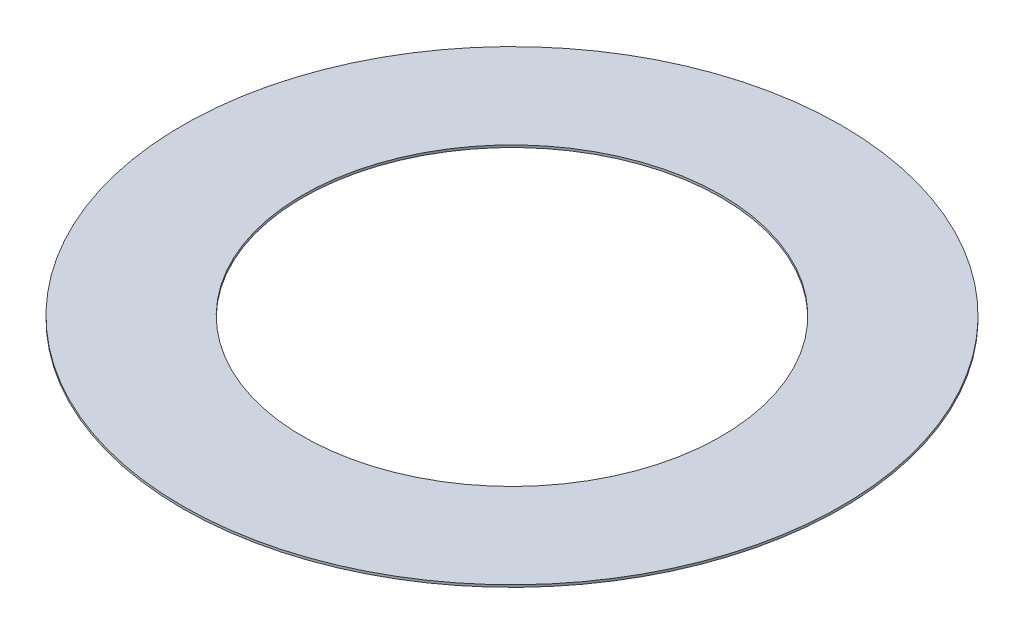
ISO-10303-21;
HEADER;
FILE_DESCRIPTION(('STEP AP214'),'2;1');
FILE_NAME('part.step','',(''),(''),'','','');
FILE_SCHEMA(('AUTOMOTIVE_DESIGN { 1 0 10303 214 1 1 1 1 }'));
ENDSEC;
DATA;
#1=APPLICATION_CONTEXT('core data for automotive mechanical design processes');
#2=APPLICATION_PROTOCOL_DEFINITION('international standard','automotive_design',2000,#1);
#3=PRODUCT_CONTEXT('',#1,'mechanical');
#4=PRODUCT('Part','Part','',(#3));
#5=PRODUCT_RELATED_PRODUCT_CATEGORY('part','',(#4));
#6=PRODUCT_DEFINITION_FORMATION('','',#4);
#7=PRODUCT_DEFINITION_CONTEXT('part definition',#1,'design');
#8=PRODUCT_DEFINITION('design','',#6,#7);
#9=PRODUCT_DEFINITION_SHAPE('','',#8);
#10=(LENGTH_UNIT() NAMED_UNIT(*) SI_UNIT(.MILLI.,.METRE.));
#11=(NAMED_UNIT(*) PLANE_ANGLE_UNIT() SI_UNIT($,.RADIAN.));
#12=(NAMED_UNIT(*) SI_UNIT($,.STERADIAN.) SOLID_ANGLE_UNIT());
#13=UNCERTAINTY_MEASURE_WITH_UNIT(LENGTH_MEASURE(1.E-05),#10,'distance_accuracy_value','');
#14=(GEOMETRIC_REPRESENTATION_CONTEXT(3) GLOBAL_UNCERTAINTY_ASSIGNED_CONTEXT((#13)) GLOBAL_UNIT_ASSIGNED_CONTEXT((#10,
#11,#12)) REPRESENTATION_CONTEXT('',''));
#15=CARTESIAN_POINT('',(0.,0.,0.));
#16=DIRECTION('',(0.,0.,1.));
#17=DIRECTION('',(1.,0.,0.));
#18=AXIS2_PLACEMENT_3D('',#15,#16,#17);
#19=CARTESIAN_POINT('',(-69.5,8.1325,0.));
#20=DIRECTION('',(0.,-1.,0.));
#21=DIRECTION('',(0.,0.,-1.));
#22=AXIS2_PLACEMENT_3D('',#19,#20,#21);
#23=PLANE('',#22);
#24=CARTESIAN_POINT('',(0.,8.13249999998789,0.));
#25=DIRECTION('',(0.,-1.,0.));
#26=DIRECTION('',(0.,0.,-1.));
#27=AXIS2_PLACEMENT_3D('',#24,#25,#26);
#28=CIRCLE('',#27,109.5);
#29=CARTESIAN_POINT('',(0.,8.13249999998789,-109.5));
#30=VERTEX_POINT('',#29);
#31=EDGE_CURVE('E10',#30,#30,#28,.T.);
#32=ORIENTED_EDGE('',*,*,#31,.F.);
#33=EDGE_LOOP('',(#32));
#34=FACE_BOUND('',#33,.T.);
#35=CARTESIAN_POINT('',(0.,8.13249999998789,0.));
#36=DIRECTION('',(0.,-1.,0.));
#37=DIRECTION('',(0.,0.,-1.));
#38=AXIS2_PLACEMENT_3D('',#35,#36,#37);
#39=CIRCLE('',#38,69.5);
#40=CARTESIAN_POINT('',(0.,8.13249999998789,-69.5));
#41=VERTEX_POINT('',#40);
#42=EDGE_CURVE('E53',#41,#41,#39,.T.);
#43=ORIENTED_EDGE('',*,*,#42,.T.);
#44=EDGE_LOOP('',(#43));
#45=FACE_BOUND('',#44,.T.);
#46=ADVANCED_FACE('F39',(#34,#45),#23,.F.);
#47=CARTESIAN_POINT('',(0.,-200069.047495165,0.));
#48=DIRECTION('',(0.,-1.,0.));
#49=DIRECTION('',(0.,0.,-1.));
#50=AXIS2_PLACEMENT_3D('',#47,#48,#49);
#51=CYLINDRICAL_SURFACE('',#50,109.5);
#52=CARTESIAN_POINT('',(0.,7.37250000000245,0.));
#53=DIRECTION('',(0.,-1.,0.));
#54=DIRECTION('',(0.,0.,-1.));
#55=AXIS2_PLACEMENT_3D('',#52,#53,#54);
#56=CIRCLE('',#55,109.5);
#57=CARTESIAN_POINT('',(0.,7.37250000000245,-109.5));
#58=VERTEX_POINT('',#57);
#59=EDGE_CURVE('E45',#58,#58,#56,.T.);
#60=ORIENTED_EDGE('',*,*,#59,.F.);
#61=EDGE_LOOP('',(#60));
#62=FACE_BOUND('',#61,.T.);
#63=ORIENTED_EDGE('',*,*,#31,.T.);
#64=EDGE_LOOP('',(#63));
#65=FACE_BOUND('',#64,.T.);
#66=ADVANCED_FACE('F68',(#62,#65),#51,.T.);
#67=CARTESIAN_POINT('',(-69.5,7.3725,0.));
#68=DIRECTION('',(0.,1.,0.));
#69=DIRECTION('',(0.,0.,1.));
#70=AXIS2_PLACEMENT_3D('',#67,#68,#69);
#71=PLANE('',#70);
#72=CARTESIAN_POINT('',(0.,7.37250000000245,0.));
#73=DIRECTION('',(0.,-1.,0.));
#74=DIRECTION('',(0.,0.,-1.));
#75=AXIS2_PLACEMENT_3D('',#72,#73,#74);
#76=CIRCLE('',#75,69.5);
#77=CARTESIAN_POINT('',(0.,7.37250000000245,-69.5));
#78=VERTEX_POINT('',#77);
#79=EDGE_CURVE('E49',#78,#78,#76,.T.);
#80=ORIENTED_EDGE('',*,*,#79,.F.);
#81=EDGE_LOOP('',(#80));
#82=FACE_BOUND('',#81,.T.);
#83=ORIENTED_EDGE('',*,*,#59,.T.);
#84=EDGE_LOOP('',(#83));
#85=FACE_BOUND('',#84,.T.);
#86=ADVANCED_FACE('F63',(#82,#85),#71,.F.);
#87=CARTESIAN_POINT('',(0.,-200069.047495165,0.));
#88=DIRECTION('',(0.,-1.,0.));
#89=DIRECTION('',(0.,0.,-1.));
#90=AXIS2_PLACEMENT_3D('',#87,#88,#89);
#91=CYLINDRICAL_SURFACE('',#90,69.5);
#92=ORIENTED_EDGE('',*,*,#42,.F.);
#93=EDGE_LOOP('',(#92));
#94=FACE_BOUND('',#93,.T.);
#95=ORIENTED_EDGE('',*,*,#79,.T.);
#96=EDGE_LOOP('',(#95));
#97=FACE_BOUND('',#96,.T.);
#98=ADVANCED_FACE('F60',(#94,#97),#91,.F.);
#99=CLOSED_SHELL('',(#46,#66,#86,#98));
#100=MANIFOLD_SOLID_BREP('B2',#99);
#101=ADVANCED_BREP_SHAPE_REPRESENTATION('',(#18,#100),#14);
#102=SHAPE_DEFINITION_REPRESENTATION(#9,#101);
ENDSEC;
END-ISO-10303-21;
